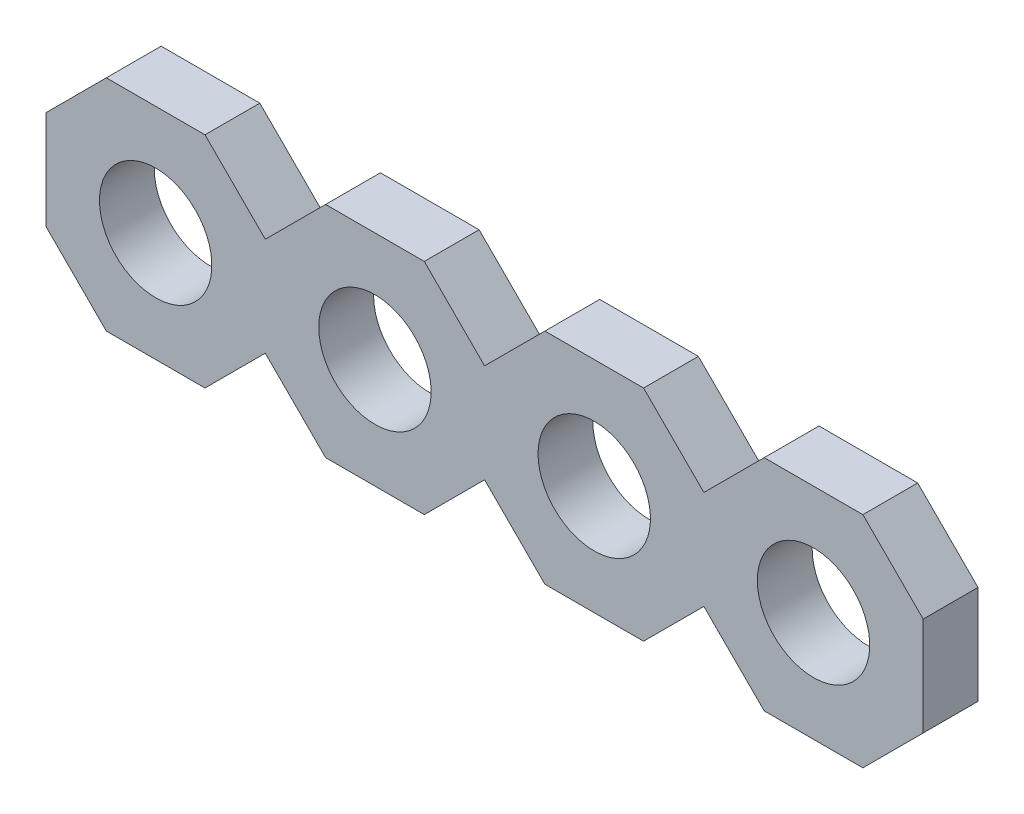
ISO-10303-21;
HEADER;
FILE_DESCRIPTION(('STEP AP214'),'2;1');
FILE_NAME('part.step','',(''),(''),'','','');
FILE_SCHEMA(('AUTOMOTIVE_DESIGN { 1 0 10303 214 1 1 1 1 }'));
ENDSEC;
DATA;
#1=APPLICATION_CONTEXT('core data for automotive mechanical design processes');
#2=APPLICATION_PROTOCOL_DEFINITION('international standard','automotive_design',2000,#1);
#3=PRODUCT_CONTEXT('',#1,'mechanical');
#4=PRODUCT('Part','Part','',(#3));
#5=PRODUCT_RELATED_PRODUCT_CATEGORY('part','',(#4));
#6=PRODUCT_DEFINITION_FORMATION('','',#4);
#7=PRODUCT_DEFINITION_CONTEXT('part definition',#1,'design');
#8=PRODUCT_DEFINITION('design','',#6,#7);
#9=PRODUCT_DEFINITION_SHAPE('','',#8);
#10=(LENGTH_UNIT() NAMED_UNIT(*) SI_UNIT(.MILLI.,.METRE.));
#11=(NAMED_UNIT(*) PLANE_ANGLE_UNIT() SI_UNIT($,.RADIAN.));
#12=(NAMED_UNIT(*) SI_UNIT($,.STERADIAN.) SOLID_ANGLE_UNIT());
#13=UNCERTAINTY_MEASURE_WITH_UNIT(LENGTH_MEASURE(1.E-05),#10,'distance_accuracy_value','');
#14=(GEOMETRIC_REPRESENTATION_CONTEXT(3) GLOBAL_UNCERTAINTY_ASSIGNED_CONTEXT((#13)) GLOBAL_UNIT_ASSIGNED_CONTEXT((#10,
#11,#12)) REPRESENTATION_CONTEXT('',''));
#15=CARTESIAN_POINT('',(0.,0.,0.));
#16=DIRECTION('',(0.,0.,1.));
#17=DIRECTION('',(1.,0.,0.));
#18=AXIS2_PLACEMENT_3D('',#15,#16,#17);
#19=CARTESIAN_POINT('',(0.,0.,0.));
#20=DIRECTION('',(0.,0.,-1.));
#21=DIRECTION('',(-1.,0.,0.));
#22=AXIS2_PLACEMENT_3D('',#19,#20,#21);
#23=PLANE('',#22);
#24=CARTESIAN_POINT('',(-24.,0.,0.));
#25=DIRECTION('',(0.,0.,-1.));
#26=DIRECTION('',(-1.,0.,0.));
#27=AXIS2_PLACEMENT_3D('',#24,#25,#26);
#28=CIRCLE('',#27,2.05);
#29=CARTESIAN_POINT('',(-26.05,0.,0.));
#30=VERTEX_POINT('',#29);
#31=EDGE_CURVE('E221',#30,#30,#28,.F.);
#32=ORIENTED_EDGE('',*,*,#31,.T.);
#33=EDGE_LOOP('',(#32));
#34=FACE_BOUND('',#33,.T.);
#35=CARTESIAN_POINT('',(-16.,0.,0.));
#36=DIRECTION('',(0.,0.,-1.));
#37=DIRECTION('',(-1.,0.,0.));
#38=AXIS2_PLACEMENT_3D('',#35,#36,#37);
#39=CIRCLE('',#38,2.05);
#40=CARTESIAN_POINT('',(-18.05,0.,0.));
#41=VERTEX_POINT('',#40);
#42=EDGE_CURVE('E224',#41,#41,#39,.F.);
#43=ORIENTED_EDGE('',*,*,#42,.T.);
#44=EDGE_LOOP('',(#43));
#45=FACE_BOUND('',#44,.T.);
#46=CARTESIAN_POINT('',(-8.,0.,0.));
#47=DIRECTION('',(0.,0.,-1.));
#48=DIRECTION('',(-1.,0.,0.));
#49=AXIS2_PLACEMENT_3D('',#46,#47,#48);
#50=CIRCLE('',#49,2.05);
#51=CARTESIAN_POINT('',(-10.05,0.,0.));
#52=VERTEX_POINT('',#51);
#53=EDGE_CURVE('E226',#52,#52,#50,.F.);
#54=ORIENTED_EDGE('',*,*,#53,.T.);
#55=EDGE_LOOP('',(#54));
#56=FACE_BOUND('',#55,.T.);
#57=CARTESIAN_POINT('',(0.,0.,0.));
#58=DIRECTION('',(0.,0.,-1.));
#59=DIRECTION('',(-1.,0.,0.));
#60=AXIS2_PLACEMENT_3D('',#57,#58,#59);
#61=CIRCLE('',#60,2.05);
#62=CARTESIAN_POINT('',(-2.05,0.,0.));
#63=VERTEX_POINT('',#62);
#64=EDGE_CURVE('E20',#63,#63,#61,.F.);
#65=ORIENTED_EDGE('',*,*,#64,.T.);
#66=EDGE_LOOP('',(#65));
#67=FACE_BOUND('',#66,.T.);
#68=DIRECTION('',(0.707106781186548,-0.707106781186548,0.));
#69=VECTOR('',#68,1.);
#70=CARTESIAN_POINT('',(-6.2,4.,0.));
#71=LINE('',#70,#69);
#72=CARTESIAN_POINT('',(-6.2,4.,0.));
#73=VERTEX_POINT('',#72);
#74=CARTESIAN_POINT('',(-4.,1.8,0.));
#75=VERTEX_POINT('',#74);
#76=EDGE_CURVE('E245',#73,#75,#71,.T.);
#77=ORIENTED_EDGE('',*,*,#76,.T.);
#78=DIRECTION('',(0.707106781186548,0.707106781186548,0.));
#79=VECTOR('',#78,1.);
#80=CARTESIAN_POINT('',(-4.,1.8,0.));
#81=LINE('',#80,#79);
#82=CARTESIAN_POINT('',(-1.8,4.,0.));
#83=VERTEX_POINT('',#82);
#84=EDGE_CURVE('E240',#75,#83,#81,.T.);
#85=ORIENTED_EDGE('',*,*,#84,.T.);
#86=DIRECTION('',(1.,0.,0.));
#87=VECTOR('',#86,1.);
#88=CARTESIAN_POINT('',(-1.8,4.,0.));
#89=LINE('',#88,#87);
#90=CARTESIAN_POINT('',(1.8,4.,0.));
#91=VERTEX_POINT('',#90);
#92=EDGE_CURVE('E192',#83,#91,#89,.T.);
#93=ORIENTED_EDGE('',*,*,#92,.T.);
#94=DIRECTION('',(0.707106781186548,-0.707106781186548,0.));
#95=VECTOR('',#94,1.);
#96=CARTESIAN_POINT('',(1.8,4.,0.));
#97=LINE('',#96,#95);
#98=CARTESIAN_POINT('',(4.,1.8,0.));
#99=VERTEX_POINT('',#98);
#100=EDGE_CURVE('E191',#91,#99,#97,.T.);
#101=ORIENTED_EDGE('',*,*,#100,.T.);
#102=DIRECTION('',(0.,-1.,0.));
#103=VECTOR('',#102,1.);
#104=CARTESIAN_POINT('',(4.,1.8,0.));
#105=LINE('',#104,#103);
#106=CARTESIAN_POINT('',(4.,-1.8,0.));
#107=VERTEX_POINT('',#106);
#108=EDGE_CURVE('E188',#99,#107,#105,.T.);
#109=ORIENTED_EDGE('',*,*,#108,.T.);
#110=DIRECTION('',(-0.707106781186548,-0.707106781186548,0.));
#111=VECTOR('',#110,1.);
#112=CARTESIAN_POINT('',(4.,-1.8,0.));
#113=LINE('',#112,#111);
#114=CARTESIAN_POINT('',(1.8,-4.,0.));
#115=VERTEX_POINT('',#114);
#116=EDGE_CURVE('E350',#107,#115,#113,.T.);
#117=ORIENTED_EDGE('',*,*,#116,.T.);
#118=DIRECTION('',(1.,0.,0.));
#119=VECTOR('',#118,1.);
#120=CARTESIAN_POINT('',(-1.8,-4.,0.));
#121=LINE('',#120,#119);
#122=CARTESIAN_POINT('',(-1.8,-4.,0.));
#123=VERTEX_POINT('',#122);
#124=EDGE_CURVE('E345',#115,#123,#121,.F.);
#125=ORIENTED_EDGE('',*,*,#124,.T.);
#126=DIRECTION('',(-0.707106781186548,0.707106781186548,0.));
#127=VECTOR('',#126,1.);
#128=CARTESIAN_POINT('',(-4.,-1.8,0.));
#129=LINE('',#128,#127);
#130=CARTESIAN_POINT('',(-4.,-1.8,0.));
#131=VERTEX_POINT('',#130);
#132=EDGE_CURVE('E340',#123,#131,#129,.T.);
#133=ORIENTED_EDGE('',*,*,#132,.T.);
#134=DIRECTION('',(-0.707106781186548,-0.707106781186548,0.));
#135=VECTOR('',#134,1.);
#136=CARTESIAN_POINT('',(-4.,-1.8,0.));
#137=LINE('',#136,#135);
#138=CARTESIAN_POINT('',(-6.2,-4.,0.));
#139=VERTEX_POINT('',#138);
#140=EDGE_CURVE('E335',#131,#139,#137,.T.);
#141=ORIENTED_EDGE('',*,*,#140,.T.);
#142=DIRECTION('',(1.,0.,0.));
#143=VECTOR('',#142,1.);
#144=CARTESIAN_POINT('',(-9.8,-4.,0.));
#145=LINE('',#144,#143);
#146=CARTESIAN_POINT('',(-9.8,-4.,0.));
#147=VERTEX_POINT('',#146);
#148=EDGE_CURVE('E330',#139,#147,#145,.F.);
#149=ORIENTED_EDGE('',*,*,#148,.T.);
#150=DIRECTION('',(-0.707106781186548,0.707106781186548,0.));
#151=VECTOR('',#150,1.);
#152=CARTESIAN_POINT('',(-12.,-1.8,0.));
#153=LINE('',#152,#151);
#154=CARTESIAN_POINT('',(-12.,-1.8,0.));
#155=VERTEX_POINT('',#154);
#156=EDGE_CURVE('E325',#147,#155,#153,.T.);
#157=ORIENTED_EDGE('',*,*,#156,.T.);
#158=DIRECTION('',(-0.707106781186548,-0.707106781186548,0.));
#159=VECTOR('',#158,1.);
#160=CARTESIAN_POINT('',(-12.,-1.8,0.));
#161=LINE('',#160,#159);
#162=CARTESIAN_POINT('',(-14.2,-4.,0.));
#163=VERTEX_POINT('',#162);
#164=EDGE_CURVE('E320',#155,#163,#161,.T.);
#165=ORIENTED_EDGE('',*,*,#164,.T.);
#166=DIRECTION('',(1.,0.,0.));
#167=VECTOR('',#166,1.);
#168=CARTESIAN_POINT('',(-17.8,-4.,0.));
#169=LINE('',#168,#167);
#170=CARTESIAN_POINT('',(-17.8,-4.,0.));
#171=VERTEX_POINT('',#170);
#172=EDGE_CURVE('E315',#163,#171,#169,.F.);
#173=ORIENTED_EDGE('',*,*,#172,.T.);
#174=DIRECTION('',(-0.707106781186548,0.707106781186548,0.));
#175=VECTOR('',#174,1.);
#176=CARTESIAN_POINT('',(-20.,-1.8,0.));
#177=LINE('',#176,#175);
#178=CARTESIAN_POINT('',(-20.,-1.8,0.));
#179=VERTEX_POINT('',#178);
#180=EDGE_CURVE('E310',#171,#179,#177,.T.);
#181=ORIENTED_EDGE('',*,*,#180,.T.);
#182=DIRECTION('',(-0.707106781186548,-0.707106781186548,0.));
#183=VECTOR('',#182,1.);
#184=CARTESIAN_POINT('',(-20.,-1.8,0.));
#185=LINE('',#184,#183);
#186=CARTESIAN_POINT('',(-22.2,-4.,0.));
#187=VERTEX_POINT('',#186);
#188=EDGE_CURVE('E305',#179,#187,#185,.T.);
#189=ORIENTED_EDGE('',*,*,#188,.T.);
#190=DIRECTION('',(1.,0.,0.));
#191=VECTOR('',#190,1.);
#192=CARTESIAN_POINT('',(-25.8,-4.,0.));
#193=LINE('',#192,#191);
#194=CARTESIAN_POINT('',(-25.8,-4.,0.));
#195=VERTEX_POINT('',#194);
#196=EDGE_CURVE('E300',#187,#195,#193,.F.);
#197=ORIENTED_EDGE('',*,*,#196,.T.);
#198=DIRECTION('',(-0.707106781186548,0.707106781186548,0.));
#199=VECTOR('',#198,1.);
#200=CARTESIAN_POINT('',(-28.,-1.8,0.));
#201=LINE('',#200,#199);
#202=CARTESIAN_POINT('',(-28.,-1.8,0.));
#203=VERTEX_POINT('',#202);
#204=EDGE_CURVE('E295',#195,#203,#201,.T.);
#205=ORIENTED_EDGE('',*,*,#204,.T.);
#206=DIRECTION('',(0.,1.,0.));
#207=VECTOR('',#206,1.);
#208=CARTESIAN_POINT('',(-28.,1.8,0.));
#209=LINE('',#208,#207);
#210=CARTESIAN_POINT('',(-28.,1.8,0.));
#211=VERTEX_POINT('',#210);
#212=EDGE_CURVE('E290',#203,#211,#209,.T.);
#213=ORIENTED_EDGE('',*,*,#212,.T.);
#214=DIRECTION('',(0.707106781186548,0.707106781186548,0.));
#215=VECTOR('',#214,1.);
#216=CARTESIAN_POINT('',(-28.,1.8,0.));
#217=LINE('',#216,#215);
#218=CARTESIAN_POINT('',(-25.8,4.,0.));
#219=VERTEX_POINT('',#218);
#220=EDGE_CURVE('E285',#211,#219,#217,.T.);
#221=ORIENTED_EDGE('',*,*,#220,.T.);
#222=DIRECTION('',(1.,0.,0.));
#223=VECTOR('',#222,1.);
#224=CARTESIAN_POINT('',(-25.8,4.,0.));
#225=LINE('',#224,#223);
#226=CARTESIAN_POINT('',(-22.2,4.,0.));
#227=VERTEX_POINT('',#226);
#228=EDGE_CURVE('E280',#219,#227,#225,.T.);
#229=ORIENTED_EDGE('',*,*,#228,.T.);
#230=DIRECTION('',(0.707106781186548,-0.707106781186548,0.));
#231=VECTOR('',#230,1.);
#232=CARTESIAN_POINT('',(-22.2,4.,0.));
#233=LINE('',#232,#231);
#234=CARTESIAN_POINT('',(-20.,1.8,0.));
#235=VERTEX_POINT('',#234);
#236=EDGE_CURVE('E275',#227,#235,#233,.T.);
#237=ORIENTED_EDGE('',*,*,#236,.T.);
#238=DIRECTION('',(0.707106781186548,0.707106781186548,0.));
#239=VECTOR('',#238,1.);
#240=CARTESIAN_POINT('',(-20.,1.8,0.));
#241=LINE('',#240,#239);
#242=CARTESIAN_POINT('',(-17.8,4.,0.));
#243=VERTEX_POINT('',#242);
#244=EDGE_CURVE('E270',#235,#243,#241,.T.);
#245=ORIENTED_EDGE('',*,*,#244,.T.);
#246=DIRECTION('',(1.,0.,0.));
#247=VECTOR('',#246,1.);
#248=CARTESIAN_POINT('',(-17.8,4.,0.));
#249=LINE('',#248,#247);
#250=CARTESIAN_POINT('',(-14.2,4.,0.));
#251=VERTEX_POINT('',#250);
#252=EDGE_CURVE('E265',#243,#251,#249,.T.);
#253=ORIENTED_EDGE('',*,*,#252,.T.);
#254=DIRECTION('',(0.707106781186548,-0.707106781186548,0.));
#255=VECTOR('',#254,1.);
#256=CARTESIAN_POINT('',(-14.2,4.,0.));
#257=LINE('',#256,#255);
#258=CARTESIAN_POINT('',(-12.,1.8,0.));
#259=VERTEX_POINT('',#258);
#260=EDGE_CURVE('E260',#251,#259,#257,.T.);
#261=ORIENTED_EDGE('',*,*,#260,.T.);
#262=DIRECTION('',(0.707106781186548,0.707106781186548,0.));
#263=VECTOR('',#262,1.);
#264=CARTESIAN_POINT('',(-12.,1.8,0.));
#265=LINE('',#264,#263);
#266=CARTESIAN_POINT('',(-9.8,4.,0.));
#267=VERTEX_POINT('',#266);
#268=EDGE_CURVE('E255',#259,#267,#265,.T.);
#269=ORIENTED_EDGE('',*,*,#268,.T.);
#270=DIRECTION('',(1.,0.,0.));
#271=VECTOR('',#270,1.);
#272=CARTESIAN_POINT('',(-9.8,4.,0.));
#273=LINE('',#272,#271);
#274=EDGE_CURVE('E250',#267,#73,#273,.T.);
#275=ORIENTED_EDGE('',*,*,#274,.T.);
#276=EDGE_LOOP('',(#77,#85,#93,#101,#109,#117,#125,#133,#141,#149,#157,#165,#173,#181,#189,#197,
#205,#213,#221,#229,#237,#245,#253,#261,#269,#275));
#277=FACE_BOUND('',#276,.T.);
#278=ADVANCED_FACE('F17',(#34,#45,#56,#67,#277),#23,.T.);
#279=CARTESIAN_POINT('',(1.8,4.,2.));
#280=DIRECTION('',(-0.707106781186548,-0.707106781186548,0.));
#281=DIRECTION('',(0.707106781186548,-0.707106781186548,0.));
#282=AXIS2_PLACEMENT_3D('',#279,#280,#281);
#283=PLANE('',#282);
#284=DIRECTION('',(0.,0.,-1.));
#285=VECTOR('',#284,1.);
#286=CARTESIAN_POINT('',(1.8,4.,2.));
#287=LINE('',#286,#285);
#288=CARTESIAN_POINT('',(1.8,4.,2.));
#289=VERTEX_POINT('',#288);
#290=EDGE_CURVE('E234',#91,#289,#287,.F.);
#291=ORIENTED_EDGE('',*,*,#290,.T.);
#292=DIRECTION('',(0.707106781186548,-0.707106781186547,0.));
#293=VECTOR('',#292,1.);
#294=CARTESIAN_POINT('',(1.8,4.,2.));
#295=LINE('',#294,#293);
#296=CARTESIAN_POINT('',(4.,1.8,2.));
#297=VERTEX_POINT('',#296);
#298=EDGE_CURVE('E208',#289,#297,#295,.T.);
#299=ORIENTED_EDGE('',*,*,#298,.T.);
#300=DIRECTION('',(0.,0.,1.));
#301=VECTOR('',#300,1.);
#302=CARTESIAN_POINT('',(4.,1.8,2.));
#303=LINE('',#302,#301);
#304=EDGE_CURVE('E197',#297,#99,#303,.F.);
#305=ORIENTED_EDGE('',*,*,#304,.T.);
#306=ORIENTED_EDGE('',*,*,#100,.F.);
#307=EDGE_LOOP('',(#291,#299,#305,#306));
#308=FACE_BOUND('',#307,.T.);
#309=ADVANCED_FACE('F207',(#308),#283,.F.);
#310=CARTESIAN_POINT('',(4.,1.8,2.));
#311=DIRECTION('',(-1.,0.,0.));
#312=DIRECTION('',(0.,-1.,0.));
#313=AXIS2_PLACEMENT_3D('',#310,#311,#312);
#314=PLANE('',#313);
#315=ORIENTED_EDGE('',*,*,#304,.F.);
#316=DIRECTION('',(0.,1.,0.));
#317=VECTOR('',#316,1.);
#318=CARTESIAN_POINT('',(4.,0.,2.));
#319=LINE('',#318,#317);
#320=CARTESIAN_POINT('',(4.,-1.8,2.));
#321=VERTEX_POINT('',#320);
#322=EDGE_CURVE('E364',#297,#321,#319,.F.);
#323=ORIENTED_EDGE('',*,*,#322,.T.);
#324=DIRECTION('',(0.,0.,1.));
#325=VECTOR('',#324,1.);
#326=CARTESIAN_POINT('',(4.,-1.8,2.));
#327=LINE('',#326,#325);
#328=EDGE_CURVE('E204',#321,#107,#327,.F.);
#329=ORIENTED_EDGE('',*,*,#328,.T.);
#330=ORIENTED_EDGE('',*,*,#108,.F.);
#331=EDGE_LOOP('',(#315,#323,#329,#330));
#332=FACE_BOUND('',#331,.T.);
#333=ADVANCED_FACE('F201',(#332),#314,.F.);
#334=CARTESIAN_POINT('',(4.,-1.8,2.));
#335=DIRECTION('',(-0.707106781186548,0.707106781186548,0.));
#336=DIRECTION('',(-0.707106781186548,-0.707106781186548,0.));
#337=AXIS2_PLACEMENT_3D('',#334,#335,#336);
#338=PLANE('',#337);
#339=ORIENTED_EDGE('',*,*,#328,.F.);
#340=DIRECTION('',(-0.707106781186548,-0.707106781186547,0.));
#341=VECTOR('',#340,1.);
#342=CARTESIAN_POINT('',(4.,-1.8,2.));
#343=LINE('',#342,#341);
#344=CARTESIAN_POINT('',(1.8,-4.,2.));
#345=VERTEX_POINT('',#344);
#346=EDGE_CURVE('E361',#321,#345,#343,.T.);
#347=ORIENTED_EDGE('',*,*,#346,.T.);
#348=DIRECTION('',(0.,0.,1.));
#349=VECTOR('',#348,1.);
#350=CARTESIAN_POINT('',(1.8,-4.,2.));
#351=LINE('',#350,#349);
#352=EDGE_CURVE('E347',#345,#115,#351,.F.);
#353=ORIENTED_EDGE('',*,*,#352,.T.);
#354=ORIENTED_EDGE('',*,*,#116,.F.);
#355=EDGE_LOOP('',(#339,#347,#353,#354));
#356=FACE_BOUND('',#355,.T.);
#357=ADVANCED_FACE('F359',(#356),#338,.F.);
#358=CARTESIAN_POINT('',(-1.8,-4.,2.));
#359=DIRECTION('',(0.,1.,0.));
#360=DIRECTION('',(0.,0.,1.));
#361=AXIS2_PLACEMENT_3D('',#358,#359,#360);
#362=PLANE('',#361);
#363=ORIENTED_EDGE('',*,*,#352,.F.);
#364=DIRECTION('',(-1.,0.,0.));
#365=VECTOR('',#364,1.);
#366=CARTESIAN_POINT('',(0.,-4.,2.));
#367=LINE('',#366,#365);
#368=CARTESIAN_POINT('',(-1.8,-4.,2.));
#369=VERTEX_POINT('',#368);
#370=EDGE_CURVE('E363',#345,#369,#367,.T.);
#371=ORIENTED_EDGE('',*,*,#370,.T.);
#372=DIRECTION('',(0.,0.,1.));
#373=VECTOR('',#372,1.);
#374=CARTESIAN_POINT('',(-1.8,-4.,2.));
#375=LINE('',#374,#373);
#376=EDGE_CURVE('E342',#369,#123,#375,.F.);
#377=ORIENTED_EDGE('',*,*,#376,.T.);
#378=ORIENTED_EDGE('',*,*,#124,.F.);
#379=EDGE_LOOP('',(#363,#371,#377,#378));
#380=FACE_BOUND('',#379,.T.);
#381=ADVANCED_FACE('F355',(#380),#362,.F.);
#382=CARTESIAN_POINT('',(-4.,-1.8,2.));
#383=DIRECTION('',(0.707106781186548,0.707106781186548,0.));
#384=DIRECTION('',(-0.707106781186548,0.707106781186548,0.));
#385=AXIS2_PLACEMENT_3D('',#382,#383,#384);
#386=PLANE('',#385);
#387=ORIENTED_EDGE('',*,*,#376,.F.);
#388=DIRECTION('',(-0.707106781186548,0.707106781186547,0.));
#389=VECTOR('',#388,1.);
#390=CARTESIAN_POINT('',(-1.8,-4.,2.));
#391=LINE('',#390,#389);
#392=CARTESIAN_POINT('',(-4.,-1.8,2.));
#393=VERTEX_POINT('',#392);
#394=EDGE_CURVE('E366',#369,#393,#391,.T.);
#395=ORIENTED_EDGE('',*,*,#394,.T.);
#396=DIRECTION('',(0.,0.,1.));
#397=VECTOR('',#396,1.);
#398=CARTESIAN_POINT('',(-4.,-1.8,2.));
#399=LINE('',#398,#397);
#400=EDGE_CURVE('E337',#393,#131,#399,.F.);
#401=ORIENTED_EDGE('',*,*,#400,.T.);
#402=ORIENTED_EDGE('',*,*,#132,.F.);
#403=EDGE_LOOP('',(#387,#395,#401,#402));
#404=FACE_BOUND('',#403,.T.);
#405=ADVANCED_FACE('F515',(#404),#386,.F.);
#406=CARTESIAN_POINT('',(-4.,-1.8,2.));
#407=DIRECTION('',(-0.707106781186548,0.707106781186548,0.));
#408=DIRECTION('',(-0.707106781186548,-0.707106781186548,0.));
#409=AXIS2_PLACEMENT_3D('',#406,#407,#408);
#410=PLANE('',#409);
#411=ORIENTED_EDGE('',*,*,#400,.F.);
#412=DIRECTION('',(-0.707106781186548,-0.707106781186547,0.));
#413=VECTOR('',#412,1.);
#414=CARTESIAN_POINT('',(-4.,-1.8,2.));
#415=LINE('',#414,#413);
#416=CARTESIAN_POINT('',(-6.2,-4.,2.));
#417=VERTEX_POINT('',#416);
#418=EDGE_CURVE('E371',#393,#417,#415,.T.);
#419=ORIENTED_EDGE('',*,*,#418,.T.);
#420=DIRECTION('',(0.,0.,1.));
#421=VECTOR('',#420,1.);
#422=CARTESIAN_POINT('',(-6.2,-4.,2.));
#423=LINE('',#422,#421);
#424=EDGE_CURVE('E332',#417,#139,#423,.F.);
#425=ORIENTED_EDGE('',*,*,#424,.T.);
#426=ORIENTED_EDGE('',*,*,#140,.F.);
#427=EDGE_LOOP('',(#411,#419,#425,#426));
#428=FACE_BOUND('',#427,.T.);
#429=ADVANCED_FACE('F512',(#428),#410,.F.);
#430=CARTESIAN_POINT('',(-9.8,-4.,2.));
#431=DIRECTION('',(0.,1.,0.));
#432=DIRECTION('',(0.,0.,1.));
#433=AXIS2_PLACEMENT_3D('',#430,#431,#432);
#434=PLANE('',#433);
#435=ORIENTED_EDGE('',*,*,#424,.F.);
#436=DIRECTION('',(-1.,0.,0.));
#437=VECTOR('',#436,1.);
#438=CARTESIAN_POINT('',(0.,-4.,2.));
#439=LINE('',#438,#437);
#440=CARTESIAN_POINT('',(-9.8,-4.,2.));
#441=VERTEX_POINT('',#440);
#442=EDGE_CURVE('E374',#417,#441,#439,.T.);
#443=ORIENTED_EDGE('',*,*,#442,.T.);
#444=DIRECTION('',(0.,0.,1.));
#445=VECTOR('',#444,1.);
#446=CARTESIAN_POINT('',(-9.8,-4.,2.));
#447=LINE('',#446,#445);
#448=EDGE_CURVE('E327',#441,#147,#447,.F.);
#449=ORIENTED_EDGE('',*,*,#448,.T.);
#450=ORIENTED_EDGE('',*,*,#148,.F.);
#451=EDGE_LOOP('',(#435,#443,#449,#450));
#452=FACE_BOUND('',#451,.T.);
#453=ADVANCED_FACE('F508',(#452),#434,.F.);
#454=CARTESIAN_POINT('',(-12.,-1.8,2.));
#455=DIRECTION('',(0.707106781186548,0.707106781186548,0.));
#456=DIRECTION('',(-0.707106781186548,0.707106781186548,0.));
#457=AXIS2_PLACEMENT_3D('',#454,#455,#456);
#458=PLANE('',#457);
#459=ORIENTED_EDGE('',*,*,#448,.F.);
#460=DIRECTION('',(-0.707106781186547,0.707106781186548,0.));
#461=VECTOR('',#460,1.);
#462=CARTESIAN_POINT('',(-9.8,-4.,2.));
#463=LINE('',#462,#461);
#464=CARTESIAN_POINT('',(-12.,-1.8,2.));
#465=VERTEX_POINT('',#464);
#466=EDGE_CURVE('E377',#441,#465,#463,.T.);
#467=ORIENTED_EDGE('',*,*,#466,.T.);
#468=DIRECTION('',(0.,0.,1.));
#469=VECTOR('',#468,1.);
#470=CARTESIAN_POINT('',(-12.,-1.8,2.));
#471=LINE('',#470,#469);
#472=EDGE_CURVE('E322',#465,#155,#471,.F.);
#473=ORIENTED_EDGE('',*,*,#472,.T.);
#474=ORIENTED_EDGE('',*,*,#156,.F.);
#475=EDGE_LOOP('',(#459,#467,#473,#474));
#476=FACE_BOUND('',#475,.T.);
#477=ADVANCED_FACE('F504',(#476),#458,.F.);
#478=CARTESIAN_POINT('',(-12.,-1.8,2.));
#479=DIRECTION('',(-0.707106781186548,0.707106781186548,0.));
#480=DIRECTION('',(-0.707106781186548,-0.707106781186548,0.));
#481=AXIS2_PLACEMENT_3D('',#478,#479,#480);
#482=PLANE('',#481);
#483=ORIENTED_EDGE('',*,*,#472,.F.);
#484=DIRECTION('',(-0.707106781186548,-0.707106781186547,0.));
#485=VECTOR('',#484,1.);
#486=CARTESIAN_POINT('',(-12.,-1.8,2.));
#487=LINE('',#486,#485);
#488=CARTESIAN_POINT('',(-14.2,-4.,2.));
#489=VERTEX_POINT('',#488);
#490=EDGE_CURVE('E380',#465,#489,#487,.T.);
#491=ORIENTED_EDGE('',*,*,#490,.T.);
#492=DIRECTION('',(0.,0.,1.));
#493=VECTOR('',#492,1.);
#494=CARTESIAN_POINT('',(-14.2,-4.,2.));
#495=LINE('',#494,#493);
#496=EDGE_CURVE('E317',#489,#163,#495,.F.);
#497=ORIENTED_EDGE('',*,*,#496,.T.);
#498=ORIENTED_EDGE('',*,*,#164,.F.);
#499=EDGE_LOOP('',(#483,#491,#497,#498));
#500=FACE_BOUND('',#499,.T.);
#501=ADVANCED_FACE('F500',(#500),#482,.F.);
#502=CARTESIAN_POINT('',(-17.8,-4.,2.));
#503=DIRECTION('',(0.,1.,0.));
#504=DIRECTION('',(0.,0.,1.));
#505=AXIS2_PLACEMENT_3D('',#502,#503,#504);
#506=PLANE('',#505);
#507=ORIENTED_EDGE('',*,*,#496,.F.);
#508=DIRECTION('',(-1.,0.,0.));
#509=VECTOR('',#508,1.);
#510=CARTESIAN_POINT('',(0.,-4.,2.));
#511=LINE('',#510,#509);
#512=CARTESIAN_POINT('',(-17.8,-4.,2.));
#513=VERTEX_POINT('',#512);
#514=EDGE_CURVE('E383',#489,#513,#511,.T.);
#515=ORIENTED_EDGE('',*,*,#514,.T.);
#516=DIRECTION('',(0.,0.,1.));
#517=VECTOR('',#516,1.);
#518=CARTESIAN_POINT('',(-17.8,-4.,2.));
#519=LINE('',#518,#517);
#520=EDGE_CURVE('E312',#513,#171,#519,.F.);
#521=ORIENTED_EDGE('',*,*,#520,.T.);
#522=ORIENTED_EDGE('',*,*,#172,.F.);
#523=EDGE_LOOP('',(#507,#515,#521,#522));
#524=FACE_BOUND('',#523,.T.);
#525=ADVANCED_FACE('F496',(#524),#506,.F.);
#526=CARTESIAN_POINT('',(-20.,-1.8,2.));
#527=DIRECTION('',(0.707106781186548,0.707106781186548,0.));
#528=DIRECTION('',(-0.707106781186548,0.707106781186548,0.));
#529=AXIS2_PLACEMENT_3D('',#526,#527,#528);
#530=PLANE('',#529);
#531=ORIENTED_EDGE('',*,*,#520,.F.);
#532=DIRECTION('',(-0.707106781186548,0.707106781186547,0.));
#533=VECTOR('',#532,1.);
#534=CARTESIAN_POINT('',(-17.8,-4.,2.));
#535=LINE('',#534,#533);
#536=CARTESIAN_POINT('',(-20.,-1.8,2.));
#537=VERTEX_POINT('',#536);
#538=EDGE_CURVE('E386',#513,#537,#535,.T.);
#539=ORIENTED_EDGE('',*,*,#538,.T.);
#540=DIRECTION('',(0.,0.,1.));
#541=VECTOR('',#540,1.);
#542=CARTESIAN_POINT('',(-20.,-1.8,2.));
#543=LINE('',#542,#541);
#544=EDGE_CURVE('E307',#537,#179,#543,.F.);
#545=ORIENTED_EDGE('',*,*,#544,.T.);
#546=ORIENTED_EDGE('',*,*,#180,.F.);
#547=EDGE_LOOP('',(#531,#539,#545,#546));
#548=FACE_BOUND('',#547,.T.);
#549=ADVANCED_FACE('F492',(#548),#530,.F.);
#550=CARTESIAN_POINT('',(-20.,-1.8,2.));
#551=DIRECTION('',(-0.707106781186548,0.707106781186548,0.));
#552=DIRECTION('',(-0.707106781186548,-0.707106781186548,0.));
#553=AXIS2_PLACEMENT_3D('',#550,#551,#552);
#554=PLANE('',#553);
#555=ORIENTED_EDGE('',*,*,#544,.F.);
#556=DIRECTION('',(-0.707106781186548,-0.707106781186547,0.));
#557=VECTOR('',#556,1.);
#558=CARTESIAN_POINT('',(-20.,-1.8,2.));
#559=LINE('',#558,#557);
#560=CARTESIAN_POINT('',(-22.2,-4.,2.));
#561=VERTEX_POINT('',#560);
#562=EDGE_CURVE('E389',#537,#561,#559,.T.);
#563=ORIENTED_EDGE('',*,*,#562,.T.);
#564=DIRECTION('',(0.,0.,1.));
#565=VECTOR('',#564,1.);
#566=CARTESIAN_POINT('',(-22.2,-4.,2.));
#567=LINE('',#566,#565);
#568=EDGE_CURVE('E302',#561,#187,#567,.F.);
#569=ORIENTED_EDGE('',*,*,#568,.T.);
#570=ORIENTED_EDGE('',*,*,#188,.F.);
#571=EDGE_LOOP('',(#555,#563,#569,#570));
#572=FACE_BOUND('',#571,.T.);
#573=ADVANCED_FACE('F488',(#572),#554,.F.);
#574=CARTESIAN_POINT('',(-25.8,-4.,2.));
#575=DIRECTION('',(0.,1.,0.));
#576=DIRECTION('',(0.,0.,1.));
#577=AXIS2_PLACEMENT_3D('',#574,#575,#576);
#578=PLANE('',#577);
#579=ORIENTED_EDGE('',*,*,#568,.F.);
#580=DIRECTION('',(-1.,0.,0.));
#581=VECTOR('',#580,1.);
#582=CARTESIAN_POINT('',(0.,-4.,2.));
#583=LINE('',#582,#581);
#584=CARTESIAN_POINT('',(-25.8,-4.,2.));
#585=VERTEX_POINT('',#584);
#586=EDGE_CURVE('E392',#561,#585,#583,.T.);
#587=ORIENTED_EDGE('',*,*,#586,.T.);
#588=DIRECTION('',(0.,0.,1.));
#589=VECTOR('',#588,1.);
#590=CARTESIAN_POINT('',(-25.8,-4.,2.));
#591=LINE('',#590,#589);
#592=EDGE_CURVE('E297',#585,#195,#591,.F.);
#593=ORIENTED_EDGE('',*,*,#592,.T.);
#594=ORIENTED_EDGE('',*,*,#196,.F.);
#595=EDGE_LOOP('',(#579,#587,#593,#594));
#596=FACE_BOUND('',#595,.T.);
#597=ADVANCED_FACE('F484',(#596),#578,.F.);
#598=CARTESIAN_POINT('',(-28.,-1.8,2.));
#599=DIRECTION('',(0.707106781186548,0.707106781186548,0.));
#600=DIRECTION('',(-0.707106781186548,0.707106781186548,0.));
#601=AXIS2_PLACEMENT_3D('',#598,#599,#600);
#602=PLANE('',#601);
#603=ORIENTED_EDGE('',*,*,#592,.F.);
#604=DIRECTION('',(-0.707106781186548,0.707106781186547,0.));
#605=VECTOR('',#604,1.);
#606=CARTESIAN_POINT('',(-25.8,-4.,2.));
#607=LINE('',#606,#605);
#608=CARTESIAN_POINT('',(-28.,-1.8,2.));
#609=VERTEX_POINT('',#608);
#610=EDGE_CURVE('E395',#585,#609,#607,.T.);
#611=ORIENTED_EDGE('',*,*,#610,.T.);
#612=DIRECTION('',(0.,0.,1.));
#613=VECTOR('',#612,1.);
#614=CARTESIAN_POINT('',(-28.,-1.8,2.));
#615=LINE('',#614,#613);
#616=EDGE_CURVE('E292',#609,#203,#615,.F.);
#617=ORIENTED_EDGE('',*,*,#616,.T.);
#618=ORIENTED_EDGE('',*,*,#204,.F.);
#619=EDGE_LOOP('',(#603,#611,#617,#618));
#620=FACE_BOUND('',#619,.T.);
#621=ADVANCED_FACE('F480',(#620),#602,.F.);
#622=CARTESIAN_POINT('',(-28.,1.8,2.));
#623=DIRECTION('',(1.,0.,0.));
#624=DIRECTION('',(0.,1.,0.));
#625=AXIS2_PLACEMENT_3D('',#622,#623,#624);
#626=PLANE('',#625);
#627=ORIENTED_EDGE('',*,*,#616,.F.);
#628=DIRECTION('',(0.,1.,0.));
#629=VECTOR('',#628,1.);
#630=CARTESIAN_POINT('',(-28.,0.,2.));
#631=LINE('',#630,#629);
#632=CARTESIAN_POINT('',(-28.,1.8,2.));
#633=VERTEX_POINT('',#632);
#634=EDGE_CURVE('E398',#609,#633,#631,.T.);
#635=ORIENTED_EDGE('',*,*,#634,.T.);
#636=DIRECTION('',(0.,0.,1.));
#637=VECTOR('',#636,1.);
#638=CARTESIAN_POINT('',(-28.,1.8,2.));
#639=LINE('',#638,#637);
#640=EDGE_CURVE('E287',#633,#211,#639,.F.);
#641=ORIENTED_EDGE('',*,*,#640,.T.);
#642=ORIENTED_EDGE('',*,*,#212,.F.);
#643=EDGE_LOOP('',(#627,#635,#641,#642));
#644=FACE_BOUND('',#643,.T.);
#645=ADVANCED_FACE('F476',(#644),#626,.F.);
#646=CARTESIAN_POINT('',(-28.,1.8,2.));
#647=DIRECTION('',(0.707106781186548,-0.707106781186548,0.));
#648=DIRECTION('',(0.707106781186548,0.707106781186548,0.));
#649=AXIS2_PLACEMENT_3D('',#646,#647,#648);
#650=PLANE('',#649);
#651=ORIENTED_EDGE('',*,*,#640,.F.);
#652=DIRECTION('',(0.707106781186547,0.707106781186548,0.));
#653=VECTOR('',#652,1.);
#654=CARTESIAN_POINT('',(-28.,1.8,2.));
#655=LINE('',#654,#653);
#656=CARTESIAN_POINT('',(-25.8,4.,2.));
#657=VERTEX_POINT('',#656);
#658=EDGE_CURVE('E401',#633,#657,#655,.T.);
#659=ORIENTED_EDGE('',*,*,#658,.T.);
#660=DIRECTION('',(0.,0.,-1.));
#661=VECTOR('',#660,1.);
#662=CARTESIAN_POINT('',(-25.8,4.,2.));
#663=LINE('',#662,#661);
#664=EDGE_CURVE('E282',#657,#219,#663,.T.);
#665=ORIENTED_EDGE('',*,*,#664,.T.);
#666=ORIENTED_EDGE('',*,*,#220,.F.);
#667=EDGE_LOOP('',(#651,#659,#665,#666));
#668=FACE_BOUND('',#667,.T.);
#669=ADVANCED_FACE('F472',(#668),#650,.F.);
#670=CARTESIAN_POINT('',(-25.8,4.,2.));
#671=DIRECTION('',(0.,-1.,0.));
#672=DIRECTION('',(0.,0.,-1.));
#673=AXIS2_PLACEMENT_3D('',#670,#671,#672);
#674=PLANE('',#673);
#675=ORIENTED_EDGE('',*,*,#664,.F.);
#676=DIRECTION('',(-1.,0.,0.));
#677=VECTOR('',#676,1.);
#678=CARTESIAN_POINT('',(0.,4.,2.));
#679=LINE('',#678,#677);
#680=CARTESIAN_POINT('',(-22.2,4.,2.));
#681=VERTEX_POINT('',#680);
#682=EDGE_CURVE('E404',#657,#681,#679,.F.);
#683=ORIENTED_EDGE('',*,*,#682,.T.);
#684=DIRECTION('',(0.,0.,1.));
#685=VECTOR('',#684,1.);
#686=CARTESIAN_POINT('',(-22.2,4.,2.));
#687=LINE('',#686,#685);
#688=EDGE_CURVE('E277',#681,#227,#687,.F.);
#689=ORIENTED_EDGE('',*,*,#688,.T.);
#690=ORIENTED_EDGE('',*,*,#228,.F.);
#691=EDGE_LOOP('',(#675,#683,#689,#690));
#692=FACE_BOUND('',#691,.T.);
#693=ADVANCED_FACE('F468',(#692),#674,.F.);
#694=CARTESIAN_POINT('',(-22.2,4.,2.));
#695=DIRECTION('',(-0.707106781186548,-0.707106781186548,0.));
#696=DIRECTION('',(0.707106781186548,-0.707106781186548,0.));
#697=AXIS2_PLACEMENT_3D('',#694,#695,#696);
#698=PLANE('',#697);
#699=ORIENTED_EDGE('',*,*,#688,.F.);
#700=DIRECTION('',(0.707106781186548,-0.707106781186547,0.));
#701=VECTOR('',#700,1.);
#702=CARTESIAN_POINT('',(-22.2,4.,2.));
#703=LINE('',#702,#701);
#704=CARTESIAN_POINT('',(-20.,1.8,2.));
#705=VERTEX_POINT('',#704);
#706=EDGE_CURVE('E407',#681,#705,#703,.T.);
#707=ORIENTED_EDGE('',*,*,#706,.T.);
#708=DIRECTION('',(0.,0.,1.));
#709=VECTOR('',#708,1.);
#710=CARTESIAN_POINT('',(-20.,1.8,2.));
#711=LINE('',#710,#709);
#712=EDGE_CURVE('E272',#705,#235,#711,.F.);
#713=ORIENTED_EDGE('',*,*,#712,.T.);
#714=ORIENTED_EDGE('',*,*,#236,.F.);
#715=EDGE_LOOP('',(#699,#707,#713,#714));
#716=FACE_BOUND('',#715,.T.);
#717=ADVANCED_FACE('F464',(#716),#698,.F.);
#718=CARTESIAN_POINT('',(-20.,1.8,2.));
#719=DIRECTION('',(0.707106781186548,-0.707106781186548,0.));
#720=DIRECTION('',(0.707106781186548,0.707106781186548,0.));
#721=AXIS2_PLACEMENT_3D('',#718,#719,#720);
#722=PLANE('',#721);
#723=ORIENTED_EDGE('',*,*,#712,.F.);
#724=DIRECTION('',(0.707106781186547,0.707106781186548,0.));
#725=VECTOR('',#724,1.);
#726=CARTESIAN_POINT('',(-20.,1.8,2.));
#727=LINE('',#726,#725);
#728=CARTESIAN_POINT('',(-17.8,4.,2.));
#729=VERTEX_POINT('',#728);
#730=EDGE_CURVE('E410',#705,#729,#727,.T.);
#731=ORIENTED_EDGE('',*,*,#730,.T.);
#732=DIRECTION('',(0.,0.,-1.));
#733=VECTOR('',#732,1.);
#734=CARTESIAN_POINT('',(-17.8,4.,2.));
#735=LINE('',#734,#733);
#736=EDGE_CURVE('E267',#729,#243,#735,.T.);
#737=ORIENTED_EDGE('',*,*,#736,.T.);
#738=ORIENTED_EDGE('',*,*,#244,.F.);
#739=EDGE_LOOP('',(#723,#731,#737,#738));
#740=FACE_BOUND('',#739,.T.);
#741=ADVANCED_FACE('F460',(#740),#722,.F.);
#742=CARTESIAN_POINT('',(-17.8,4.,2.));
#743=DIRECTION('',(0.,-1.,0.));
#744=DIRECTION('',(0.,0.,-1.));
#745=AXIS2_PLACEMENT_3D('',#742,#743,#744);
#746=PLANE('',#745);
#747=ORIENTED_EDGE('',*,*,#736,.F.);
#748=DIRECTION('',(-1.,0.,0.));
#749=VECTOR('',#748,1.);
#750=CARTESIAN_POINT('',(0.,4.,2.));
#751=LINE('',#750,#749);
#752=CARTESIAN_POINT('',(-14.2,4.,2.));
#753=VERTEX_POINT('',#752);
#754=EDGE_CURVE('E413',#729,#753,#751,.F.);
#755=ORIENTED_EDGE('',*,*,#754,.T.);
#756=DIRECTION('',(0.,0.,1.));
#757=VECTOR('',#756,1.);
#758=CARTESIAN_POINT('',(-14.2,4.,2.));
#759=LINE('',#758,#757);
#760=EDGE_CURVE('E262',#753,#251,#759,.F.);
#761=ORIENTED_EDGE('',*,*,#760,.T.);
#762=ORIENTED_EDGE('',*,*,#252,.F.);
#763=EDGE_LOOP('',(#747,#755,#761,#762));
#764=FACE_BOUND('',#763,.T.);
#765=ADVANCED_FACE('F456',(#764),#746,.F.);
#766=CARTESIAN_POINT('',(-14.2,4.,2.));
#767=DIRECTION('',(-0.707106781186548,-0.707106781186548,0.));
#768=DIRECTION('',(0.707106781186548,-0.707106781186548,0.));
#769=AXIS2_PLACEMENT_3D('',#766,#767,#768);
#770=PLANE('',#769);
#771=ORIENTED_EDGE('',*,*,#760,.F.);
#772=DIRECTION('',(0.707106781186548,-0.707106781186547,0.));
#773=VECTOR('',#772,1.);
#774=CARTESIAN_POINT('',(-14.2,4.,2.));
#775=LINE('',#774,#773);
#776=CARTESIAN_POINT('',(-12.,1.8,2.));
#777=VERTEX_POINT('',#776);
#778=EDGE_CURVE('E416',#753,#777,#775,.T.);
#779=ORIENTED_EDGE('',*,*,#778,.T.);
#780=DIRECTION('',(0.,0.,1.));
#781=VECTOR('',#780,1.);
#782=CARTESIAN_POINT('',(-12.,1.8,2.));
#783=LINE('',#782,#781);
#784=EDGE_CURVE('E257',#777,#259,#783,.F.);
#785=ORIENTED_EDGE('',*,*,#784,.T.);
#786=ORIENTED_EDGE('',*,*,#260,.F.);
#787=EDGE_LOOP('',(#771,#779,#785,#786));
#788=FACE_BOUND('',#787,.T.);
#789=ADVANCED_FACE('F452',(#788),#770,.F.);
#790=CARTESIAN_POINT('',(-12.,1.8,2.));
#791=DIRECTION('',(0.707106781186548,-0.707106781186548,0.));
#792=DIRECTION('',(0.707106781186548,0.707106781186548,0.));
#793=AXIS2_PLACEMENT_3D('',#790,#791,#792);
#794=PLANE('',#793);
#795=ORIENTED_EDGE('',*,*,#784,.F.);
#796=DIRECTION('',(0.707106781186548,0.707106781186547,0.));
#797=VECTOR('',#796,1.);
#798=CARTESIAN_POINT('',(-12.,1.8,2.));
#799=LINE('',#798,#797);
#800=CARTESIAN_POINT('',(-9.8,4.,2.));
#801=VERTEX_POINT('',#800);
#802=EDGE_CURVE('E419',#777,#801,#799,.T.);
#803=ORIENTED_EDGE('',*,*,#802,.T.);
#804=DIRECTION('',(0.,0.,-1.));
#805=VECTOR('',#804,1.);
#806=CARTESIAN_POINT('',(-9.8,4.,2.));
#807=LINE('',#806,#805);
#808=EDGE_CURVE('E252',#801,#267,#807,.T.);
#809=ORIENTED_EDGE('',*,*,#808,.T.);
#810=ORIENTED_EDGE('',*,*,#268,.F.);
#811=EDGE_LOOP('',(#795,#803,#809,#810));
#812=FACE_BOUND('',#811,.T.);
#813=ADVANCED_FACE('F448',(#812),#794,.F.);
#814=CARTESIAN_POINT('',(-9.8,4.,2.));
#815=DIRECTION('',(0.,-1.,0.));
#816=DIRECTION('',(0.,0.,-1.));
#817=AXIS2_PLACEMENT_3D('',#814,#815,#816);
#818=PLANE('',#817);
#819=ORIENTED_EDGE('',*,*,#808,.F.);
#820=DIRECTION('',(-1.,0.,0.));
#821=VECTOR('',#820,1.);
#822=CARTESIAN_POINT('',(0.,4.,2.));
#823=LINE('',#822,#821);
#824=CARTESIAN_POINT('',(-6.2,4.,2.));
#825=VERTEX_POINT('',#824);
#826=EDGE_CURVE('E422',#801,#825,#823,.F.);
#827=ORIENTED_EDGE('',*,*,#826,.T.);
#828=DIRECTION('',(0.,0.,1.));
#829=VECTOR('',#828,1.);
#830=CARTESIAN_POINT('',(-6.2,4.,2.));
#831=LINE('',#830,#829);
#832=EDGE_CURVE('E247',#825,#73,#831,.F.);
#833=ORIENTED_EDGE('',*,*,#832,.T.);
#834=ORIENTED_EDGE('',*,*,#274,.F.);
#835=EDGE_LOOP('',(#819,#827,#833,#834));
#836=FACE_BOUND('',#835,.T.);
#837=ADVANCED_FACE('F444',(#836),#818,.F.);
#838=CARTESIAN_POINT('',(-6.2,4.,2.));
#839=DIRECTION('',(-0.707106781186548,-0.707106781186548,0.));
#840=DIRECTION('',(0.707106781186548,-0.707106781186548,0.));
#841=AXIS2_PLACEMENT_3D('',#838,#839,#840);
#842=PLANE('',#841);
#843=ORIENTED_EDGE('',*,*,#832,.F.);
#844=DIRECTION('',(0.707106781186548,-0.707106781186547,0.));
#845=VECTOR('',#844,1.);
#846=CARTESIAN_POINT('',(-6.2,4.,2.));
#847=LINE('',#846,#845);
#848=CARTESIAN_POINT('',(-4.,1.8,2.));
#849=VERTEX_POINT('',#848);
#850=EDGE_CURVE('E425',#825,#849,#847,.T.);
#851=ORIENTED_EDGE('',*,*,#850,.T.);
#852=DIRECTION('',(0.,0.,1.));
#853=VECTOR('',#852,1.);
#854=CARTESIAN_POINT('',(-4.,1.8,2.));
#855=LINE('',#854,#853);
#856=EDGE_CURVE('E242',#849,#75,#855,.F.);
#857=ORIENTED_EDGE('',*,*,#856,.T.);
#858=ORIENTED_EDGE('',*,*,#76,.F.);
#859=EDGE_LOOP('',(#843,#851,#857,#858));
#860=FACE_BOUND('',#859,.T.);
#861=ADVANCED_FACE('F440',(#860),#842,.F.);
#862=CARTESIAN_POINT('',(-4.,1.8,2.));
#863=DIRECTION('',(0.707106781186548,-0.707106781186548,0.));
#864=DIRECTION('',(0.707106781186548,0.707106781186548,0.));
#865=AXIS2_PLACEMENT_3D('',#862,#863,#864);
#866=PLANE('',#865);
#867=ORIENTED_EDGE('',*,*,#856,.F.);
#868=DIRECTION('',(0.707106781186548,0.707106781186547,0.));
#869=VECTOR('',#868,1.);
#870=CARTESIAN_POINT('',(-4.,1.8,2.));
#871=LINE('',#870,#869);
#872=CARTESIAN_POINT('',(-1.8,4.,2.));
#873=VERTEX_POINT('',#872);
#874=EDGE_CURVE('E428',#849,#873,#871,.T.);
#875=ORIENTED_EDGE('',*,*,#874,.T.);
#876=DIRECTION('',(0.,0.,-1.));
#877=VECTOR('',#876,1.);
#878=CARTESIAN_POINT('',(-1.8,4.,2.));
#879=LINE('',#878,#877);
#880=EDGE_CURVE('E35',#873,#83,#879,.T.);
#881=ORIENTED_EDGE('',*,*,#880,.T.);
#882=ORIENTED_EDGE('',*,*,#84,.F.);
#883=EDGE_LOOP('',(#867,#875,#881,#882));
#884=FACE_BOUND('',#883,.T.);
#885=ADVANCED_FACE('F436',(#884),#866,.F.);
#886=CARTESIAN_POINT('',(-1.8,4.,2.));
#887=DIRECTION('',(0.,-1.,0.));
#888=DIRECTION('',(0.,0.,-1.));
#889=AXIS2_PLACEMENT_3D('',#886,#887,#888);
#890=PLANE('',#889);
#891=ORIENTED_EDGE('',*,*,#880,.F.);
#892=DIRECTION('',(-1.,0.,0.));
#893=VECTOR('',#892,1.);
#894=CARTESIAN_POINT('',(0.,4.,2.));
#895=LINE('',#894,#893);
#896=EDGE_CURVE('E220',#873,#289,#895,.F.);
#897=ORIENTED_EDGE('',*,*,#896,.T.);
#898=ORIENTED_EDGE('',*,*,#290,.F.);
#899=ORIENTED_EDGE('',*,*,#92,.F.);
#900=EDGE_LOOP('',(#891,#897,#898,#899));
#901=FACE_BOUND('',#900,.T.);
#902=ADVANCED_FACE('F431',(#901),#890,.F.);
#903=CARTESIAN_POINT('',(0.,0.,2.));
#904=DIRECTION('',(0.,0.,-1.));
#905=DIRECTION('',(-1.,0.,0.));
#906=AXIS2_PLACEMENT_3D('',#903,#904,#905);
#907=CYLINDRICAL_SURFACE('',#906,2.05);
#908=ORIENTED_EDGE('',*,*,#64,.F.);
#909=EDGE_LOOP('',(#908));
#910=FACE_BOUND('',#909,.T.);
#911=CARTESIAN_POINT('',(0.,0.,2.));
#912=DIRECTION('',(0.,0.,-1.));
#913=DIRECTION('',(-1.,0.,0.));
#914=AXIS2_PLACEMENT_3D('',#911,#912,#913);
#915=CIRCLE('',#914,2.05);
#916=CARTESIAN_POINT('',(-2.05,0.,2.));
#917=VERTEX_POINT('',#916);
#918=EDGE_CURVE('E217',#917,#917,#915,.F.);
#919=ORIENTED_EDGE('',*,*,#918,.T.);
#920=EDGE_LOOP('',(#919));
#921=FACE_BOUND('',#920,.T.);
#922=ADVANCED_FACE('F544',(#910,#921),#907,.F.);
#923=CARTESIAN_POINT('',(-8.,0.,2.));
#924=DIRECTION('',(0.,0.,-1.));
#925=DIRECTION('',(-1.,0.,0.));
#926=AXIS2_PLACEMENT_3D('',#923,#924,#925);
#927=CYLINDRICAL_SURFACE('',#926,2.05);
#928=ORIENTED_EDGE('',*,*,#53,.F.);
#929=EDGE_LOOP('',(#928));
#930=FACE_BOUND('',#929,.T.);
#931=CARTESIAN_POINT('',(-8.,0.,2.));
#932=DIRECTION('',(0.,0.,-1.));
#933=DIRECTION('',(-1.,0.,0.));
#934=AXIS2_PLACEMENT_3D('',#931,#932,#933);
#935=CIRCLE('',#934,2.05);
#936=CARTESIAN_POINT('',(-10.05,0.,2.));
#937=VERTEX_POINT('',#936);
#938=EDGE_CURVE('E214',#937,#937,#935,.F.);
#939=ORIENTED_EDGE('',*,*,#938,.T.);
#940=EDGE_LOOP('',(#939));
#941=FACE_BOUND('',#940,.T.);
#942=ADVANCED_FACE('F540',(#930,#941),#927,.F.);
#943=CARTESIAN_POINT('',(-16.,0.,2.));
#944=DIRECTION('',(0.,0.,-1.));
#945=DIRECTION('',(-1.,0.,0.));
#946=AXIS2_PLACEMENT_3D('',#943,#944,#945);
#947=CYLINDRICAL_SURFACE('',#946,2.05);
#948=ORIENTED_EDGE('',*,*,#42,.F.);
#949=EDGE_LOOP('',(#948));
#950=FACE_BOUND('',#949,.T.);
#951=CARTESIAN_POINT('',(-16.,0.,2.));
#952=DIRECTION('',(0.,0.,-1.));
#953=DIRECTION('',(-1.,0.,0.));
#954=AXIS2_PLACEMENT_3D('',#951,#952,#953);
#955=CIRCLE('',#954,2.05);
#956=CARTESIAN_POINT('',(-18.05,0.,2.));
#957=VERTEX_POINT('',#956);
#958=EDGE_CURVE('E26',#957,#957,#955,.F.);
#959=ORIENTED_EDGE('',*,*,#958,.T.);
#960=EDGE_LOOP('',(#959));
#961=FACE_BOUND('',#960,.T.);
#962=ADVANCED_FACE('F532',(#950,#961),#947,.F.);
#963=CARTESIAN_POINT('',(-24.,0.,2.));
#964=DIRECTION('',(0.,0.,-1.));
#965=DIRECTION('',(-1.,0.,0.));
#966=AXIS2_PLACEMENT_3D('',#963,#964,#965);
#967=CYLINDRICAL_SURFACE('',#966,2.05);
#968=ORIENTED_EDGE('',*,*,#31,.F.);
#969=EDGE_LOOP('',(#968));
#970=FACE_BOUND('',#969,.T.);
#971=CARTESIAN_POINT('',(-24.,0.,2.));
#972=DIRECTION('',(0.,0.,-1.));
#973=DIRECTION('',(-1.,0.,0.));
#974=AXIS2_PLACEMENT_3D('',#971,#972,#973);
#975=CIRCLE('',#974,2.05);
#976=CARTESIAN_POINT('',(-26.05,0.,2.));
#977=VERTEX_POINT('',#976);
#978=EDGE_CURVE('E10',#977,#977,#975,.F.);
#979=ORIENTED_EDGE('',*,*,#978,.T.);
#980=EDGE_LOOP('',(#979));
#981=FACE_BOUND('',#980,.T.);
#982=ADVANCED_FACE('F526',(#970,#981),#967,.F.);
#983=CARTESIAN_POINT('',(0.,0.,2.));
#984=DIRECTION('',(0.,0.,-1.));
#985=DIRECTION('',(-1.,0.,0.));
#986=AXIS2_PLACEMENT_3D('',#983,#984,#985);
#987=PLANE('',#986);
#988=ORIENTED_EDGE('',*,*,#978,.F.);
#989=EDGE_LOOP('',(#988));
#990=FACE_BOUND('',#989,.T.);
#991=ORIENTED_EDGE('',*,*,#958,.F.);
#992=EDGE_LOOP('',(#991));
#993=FACE_BOUND('',#992,.T.);
#994=ORIENTED_EDGE('',*,*,#938,.F.);
#995=EDGE_LOOP('',(#994));
#996=FACE_BOUND('',#995,.T.);
#997=ORIENTED_EDGE('',*,*,#918,.F.);
#998=EDGE_LOOP('',(#997));
#999=FACE_BOUND('',#998,.T.);
#1000=ORIENTED_EDGE('',*,*,#874,.F.);
#1001=ORIENTED_EDGE('',*,*,#850,.F.);
#1002=ORIENTED_EDGE('',*,*,#826,.F.);
#1003=ORIENTED_EDGE('',*,*,#802,.F.);
#1004=ORIENTED_EDGE('',*,*,#778,.F.);
#1005=ORIENTED_EDGE('',*,*,#754,.F.);
#1006=ORIENTED_EDGE('',*,*,#730,.F.);
#1007=ORIENTED_EDGE('',*,*,#706,.F.);
#1008=ORIENTED_EDGE('',*,*,#682,.F.);
#1009=ORIENTED_EDGE('',*,*,#658,.F.);
#1010=ORIENTED_EDGE('',*,*,#634,.F.);
#1011=ORIENTED_EDGE('',*,*,#610,.F.);
#1012=ORIENTED_EDGE('',*,*,#586,.F.);
#1013=ORIENTED_EDGE('',*,*,#562,.F.);
#1014=ORIENTED_EDGE('',*,*,#538,.F.);
#1015=ORIENTED_EDGE('',*,*,#514,.F.);
#1016=ORIENTED_EDGE('',*,*,#490,.F.);
#1017=ORIENTED_EDGE('',*,*,#466,.F.);
#1018=ORIENTED_EDGE('',*,*,#442,.F.);
#1019=ORIENTED_EDGE('',*,*,#418,.F.);
#1020=ORIENTED_EDGE('',*,*,#394,.F.);
#1021=ORIENTED_EDGE('',*,*,#370,.F.);
#1022=ORIENTED_EDGE('',*,*,#346,.F.);
#1023=ORIENTED_EDGE('',*,*,#322,.F.);
#1024=ORIENTED_EDGE('',*,*,#298,.F.);
#1025=ORIENTED_EDGE('',*,*,#896,.F.);
#1026=EDGE_LOOP('',(#1000,#1001,#1002,#1003,#1004,#1005,#1006,#1007,#1008,#1009,#1010,#1011,
#1012,#1013,#1014,#1015,#1016,#1017,#1018,#1019,#1020,#1021,#1022,#1023,#1024,#1025));
#1027=FACE_BOUND('',#1026,.T.);
#1028=ADVANCED_FACE('F433',(#990,#993,#996,#999,#1027),#987,.F.);
#1029=CLOSED_SHELL('',(#278,#309,#333,#357,#381,#405,#429,#453,#477,#501,#525,#549,#573,#597,
#621,#645,#669,#693,#717,#741,#765,#789,#813,#837,#861,#885,#902,#922,#942,#962,#982,#1028));
#1030=MANIFOLD_SOLID_BREP('B1',#1029);
#1031=ADVANCED_BREP_SHAPE_REPRESENTATION('',(#18,#1030),#14);
#1032=SHAPE_DEFINITION_REPRESENTATION(#9,#1031);
ENDSEC;
END-ISO-10303-21;
